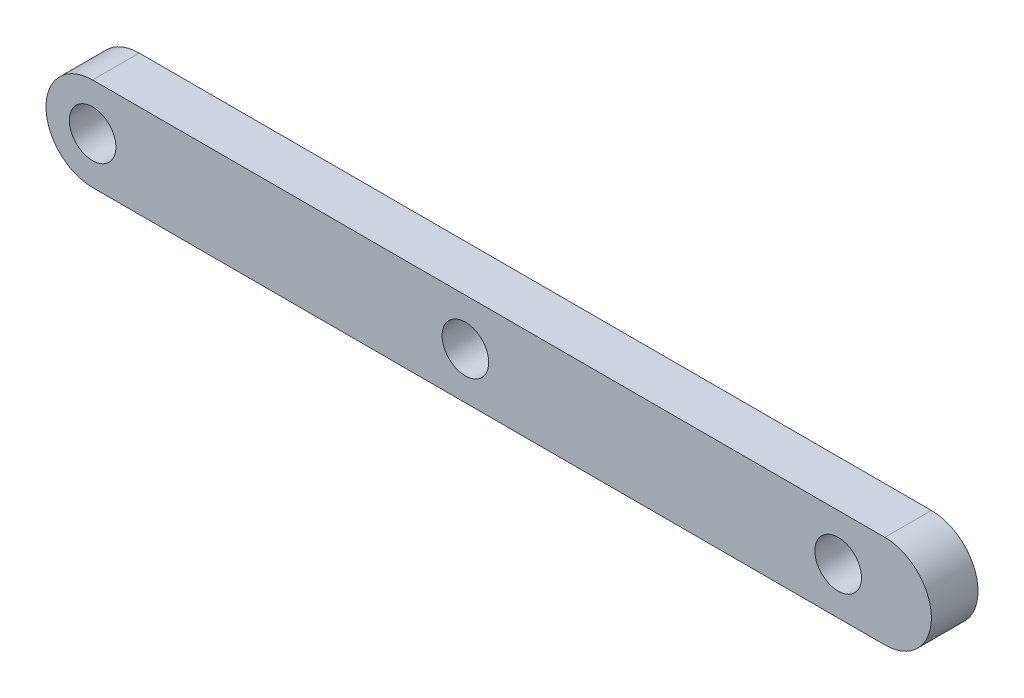
ISO-10303-21;
HEADER;
FILE_DESCRIPTION(('STEP AP214'),'2;1');
FILE_NAME('part.step','',(''),(''),'','','');
FILE_SCHEMA(('AUTOMOTIVE_DESIGN { 1 0 10303 214 1 1 1 1 }'));
ENDSEC;
DATA;
#1=APPLICATION_CONTEXT('core data for automotive mechanical design processes');
#2=APPLICATION_PROTOCOL_DEFINITION('international standard','automotive_design',2000,#1);
#3=PRODUCT_CONTEXT('',#1,'mechanical');
#4=PRODUCT('Part','Part','',(#3));
#5=PRODUCT_RELATED_PRODUCT_CATEGORY('part','',(#4));
#6=PRODUCT_DEFINITION_FORMATION('','',#4);
#7=PRODUCT_DEFINITION_CONTEXT('part definition',#1,'design');
#8=PRODUCT_DEFINITION('design','',#6,#7);
#9=PRODUCT_DEFINITION_SHAPE('','',#8);
#10=(LENGTH_UNIT() NAMED_UNIT(*) SI_UNIT(.MILLI.,.METRE.));
#11=(NAMED_UNIT(*) PLANE_ANGLE_UNIT() SI_UNIT($,.RADIAN.));
#12=(NAMED_UNIT(*) SI_UNIT($,.STERADIAN.) SOLID_ANGLE_UNIT());
#13=UNCERTAINTY_MEASURE_WITH_UNIT(LENGTH_MEASURE(1.E-05),#10,'distance_accuracy_value','');
#14=(GEOMETRIC_REPRESENTATION_CONTEXT(3) GLOBAL_UNCERTAINTY_ASSIGNED_CONTEXT((#13)) GLOBAL_UNIT_ASSIGNED_CONTEXT((#10,
#11,#12)) REPRESENTATION_CONTEXT('',''));
#15=CARTESIAN_POINT('',(0.,0.,0.));
#16=DIRECTION('',(0.,0.,1.));
#17=DIRECTION('',(1.,0.,0.));
#18=AXIS2_PLACEMENT_3D('',#15,#16,#17);
#19=CARTESIAN_POINT('',(0.,0.,2.));
#20=DIRECTION('',(0.,0.,-1.));
#21=DIRECTION('',(-1.,0.,0.));
#22=AXIS2_PLACEMENT_3D('',#19,#20,#21);
#23=CYLINDRICAL_SURFACE('',#22,2.);
#24=CARTESIAN_POINT('',(0.,0.,0.));
#25=DIRECTION('',(0.,0.,1.));
#26=DIRECTION('',(1.,0.,0.));
#27=AXIS2_PLACEMENT_3D('',#24,#25,#26);
#28=CIRCLE('',#27,2.);
#29=CARTESIAN_POINT('',(0.,2.,0.));
#30=VERTEX_POINT('',#29);
#31=CARTESIAN_POINT('',(0.,-2.,0.));
#32=VERTEX_POINT('',#31);
#33=EDGE_CURVE('E113',#30,#32,#28,.T.);
#34=ORIENTED_EDGE('',*,*,#33,.T.);
#35=DIRECTION('',(0.,0.,-1.));
#36=VECTOR('',#35,1.);
#37=CARTESIAN_POINT('',(0.,-2.,2.));
#38=LINE('',#37,#36);
#39=CARTESIAN_POINT('',(0.,-2.,2.));
#40=VERTEX_POINT('',#39);
#41=EDGE_CURVE('E11',#40,#32,#38,.T.);
#42=ORIENTED_EDGE('',*,*,#41,.F.);
#43=CARTESIAN_POINT('',(0.,0.,2.));
#44=DIRECTION('',(0.,0.,1.));
#45=DIRECTION('',(1.,0.,0.));
#46=AXIS2_PLACEMENT_3D('',#43,#44,#45);
#47=CIRCLE('',#46,2.);
#48=CARTESIAN_POINT('',(0.,2.,2.));
#49=VERTEX_POINT('',#48);
#50=EDGE_CURVE('E97',#49,#40,#47,.T.);
#51=ORIENTED_EDGE('',*,*,#50,.F.);
#52=DIRECTION('',(0.,0.,-1.));
#53=VECTOR('',#52,1.);
#54=CARTESIAN_POINT('',(0.,2.,2.));
#55=LINE('',#54,#53);
#56=EDGE_CURVE('E109',#49,#30,#55,.T.);
#57=ORIENTED_EDGE('',*,*,#56,.T.);
#58=EDGE_LOOP('',(#34,#42,#51,#57));
#59=FACE_BOUND('',#58,.T.);
#60=ADVANCED_FACE('F45',(#59),#23,.T.);
#61=CARTESIAN_POINT('',(0.,-2.,2.));
#62=DIRECTION('',(0.,1.,0.));
#63=DIRECTION('',(0.,0.,1.));
#64=AXIS2_PLACEMENT_3D('',#61,#62,#63);
#65=PLANE('',#64);
#66=DIRECTION('',(1.,0.,0.));
#67=VECTOR('',#66,1.);
#68=CARTESIAN_POINT('',(0.,-2.,0.));
#69=LINE('',#68,#67);
#70=CARTESIAN_POINT('',(34.,-2.,0.));
#71=VERTEX_POINT('',#70);
#72=EDGE_CURVE('E102',#32,#71,#69,.T.);
#73=ORIENTED_EDGE('',*,*,#72,.T.);
#74=DIRECTION('',(0.,0.,-1.));
#75=VECTOR('',#74,1.);
#76=CARTESIAN_POINT('',(34.,-2.,2.));
#77=LINE('',#76,#75);
#78=CARTESIAN_POINT('',(34.,-2.,2.));
#79=VERTEX_POINT('',#78);
#80=EDGE_CURVE('E54',#79,#71,#77,.T.);
#81=ORIENTED_EDGE('',*,*,#80,.F.);
#82=DIRECTION('',(1.,0.,0.));
#83=VECTOR('',#82,1.);
#84=CARTESIAN_POINT('',(0.,-2.,2.));
#85=LINE('',#84,#83);
#86=EDGE_CURVE('E92',#40,#79,#85,.T.);
#87=ORIENTED_EDGE('',*,*,#86,.F.);
#88=ORIENTED_EDGE('',*,*,#41,.T.);
#89=EDGE_LOOP('',(#73,#81,#87,#88));
#90=FACE_BOUND('',#89,.T.);
#91=ADVANCED_FACE('F101',(#90),#65,.F.);
#92=CARTESIAN_POINT('',(34.,0.,2.));
#93=DIRECTION('',(0.,0.,-1.));
#94=DIRECTION('',(-1.,0.,0.));
#95=AXIS2_PLACEMENT_3D('',#92,#93,#94);
#96=CYLINDRICAL_SURFACE('',#95,2.);
#97=CARTESIAN_POINT('',(34.,0.,0.));
#98=DIRECTION('',(0.,0.,1.));
#99=DIRECTION('',(1.,0.,0.));
#100=AXIS2_PLACEMENT_3D('',#97,#98,#99);
#101=CIRCLE('',#100,2.);
#102=CARTESIAN_POINT('',(34.,2.,0.));
#103=VERTEX_POINT('',#102);
#104=EDGE_CURVE('E79',#71,#103,#101,.T.);
#105=ORIENTED_EDGE('',*,*,#104,.T.);
#106=DIRECTION('',(0.,0.,-1.));
#107=VECTOR('',#106,1.);
#108=CARTESIAN_POINT('',(34.,2.,2.));
#109=LINE('',#108,#107);
#110=CARTESIAN_POINT('',(34.,2.,2.));
#111=VERTEX_POINT('',#110);
#112=EDGE_CURVE('E104',#111,#103,#109,.T.);
#113=ORIENTED_EDGE('',*,*,#112,.F.);
#114=CARTESIAN_POINT('',(34.,0.,2.));
#115=DIRECTION('',(0.,0.,1.));
#116=DIRECTION('',(1.,0.,0.));
#117=AXIS2_PLACEMENT_3D('',#114,#115,#116);
#118=CIRCLE('',#117,2.);
#119=EDGE_CURVE('E95',#79,#111,#118,.T.);
#120=ORIENTED_EDGE('',*,*,#119,.F.);
#121=ORIENTED_EDGE('',*,*,#80,.T.);
#122=EDGE_LOOP('',(#105,#113,#120,#121));
#123=FACE_BOUND('',#122,.T.);
#124=ADVANCED_FACE('F105',(#123),#96,.T.);
#125=CARTESIAN_POINT('',(0.,2.,2.));
#126=DIRECTION('',(0.,-1.,0.));
#127=DIRECTION('',(0.,0.,-1.));
#128=AXIS2_PLACEMENT_3D('',#125,#126,#127);
#129=PLANE('',#128);
#130=DIRECTION('',(-1.,0.,0.));
#131=VECTOR('',#130,1.);
#132=CARTESIAN_POINT('',(0.,2.,0.));
#133=LINE('',#132,#131);
#134=EDGE_CURVE('E85',#103,#30,#133,.T.);
#135=ORIENTED_EDGE('',*,*,#134,.T.);
#136=ORIENTED_EDGE('',*,*,#56,.F.);
#137=DIRECTION('',(-1.,0.,0.));
#138=VECTOR('',#137,1.);
#139=CARTESIAN_POINT('',(0.,2.,2.));
#140=LINE('',#139,#138);
#141=EDGE_CURVE('E62',#111,#49,#140,.T.);
#142=ORIENTED_EDGE('',*,*,#141,.F.);
#143=ORIENTED_EDGE('',*,*,#112,.T.);
#144=EDGE_LOOP('',(#135,#136,#142,#143));
#145=FACE_BOUND('',#144,.T.);
#146=ADVANCED_FACE('F127',(#145),#129,.F.);
#147=CARTESIAN_POINT('',(0.,0.,2.));
#148=DIRECTION('',(0.,0.,1.));
#149=DIRECTION('',(1.,0.,0.));
#150=AXIS2_PLACEMENT_3D('',#147,#148,#149);
#151=PLANE('',#150);
#152=CARTESIAN_POINT('',(0.,0.,2.));
#153=DIRECTION('',(0.,0.,1.));
#154=DIRECTION('',(1.,0.,0.));
#155=AXIS2_PLACEMENT_3D('',#152,#153,#154);
#156=CIRCLE('',#155,1.);
#157=CARTESIAN_POINT('',(1.,0.,2.));
#158=VERTEX_POINT('',#157);
#159=EDGE_CURVE('E150',#158,#158,#156,.T.);
#160=ORIENTED_EDGE('',*,*,#159,.F.);
#161=EDGE_LOOP('',(#160));
#162=FACE_BOUND('',#161,.T.);
#163=CARTESIAN_POINT('',(16.,0.,2.));
#164=DIRECTION('',(0.,0.,1.));
#165=DIRECTION('',(1.,0.,0.));
#166=AXIS2_PLACEMENT_3D('',#163,#164,#165);
#167=CIRCLE('',#166,1.);
#168=CARTESIAN_POINT('',(17.,0.,2.));
#169=VERTEX_POINT('',#168);
#170=EDGE_CURVE('E146',#169,#169,#167,.T.);
#171=ORIENTED_EDGE('',*,*,#170,.F.);
#172=EDGE_LOOP('',(#171));
#173=FACE_BOUND('',#172,.T.);
#174=CARTESIAN_POINT('',(32.,0.,2.));
#175=DIRECTION('',(0.,0.,1.));
#176=DIRECTION('',(1.,0.,0.));
#177=AXIS2_PLACEMENT_3D('',#174,#175,#176);
#178=CIRCLE('',#177,0.999999999999998);
#179=CARTESIAN_POINT('',(33.,0.,2.));
#180=VERTEX_POINT('',#179);
#181=EDGE_CURVE('E138',#180,#180,#178,.T.);
#182=ORIENTED_EDGE('',*,*,#181,.F.);
#183=EDGE_LOOP('',(#182));
#184=FACE_BOUND('',#183,.T.);
#185=ORIENTED_EDGE('',*,*,#50,.T.);
#186=ORIENTED_EDGE('',*,*,#86,.T.);
#187=ORIENTED_EDGE('',*,*,#119,.T.);
#188=ORIENTED_EDGE('',*,*,#141,.T.);
#189=EDGE_LOOP('',(#185,#186,#187,#188));
#190=FACE_BOUND('',#189,.T.);
#191=ADVANCED_FACE('F93',(#162,#173,#184,#190),#151,.T.);
#192=CARTESIAN_POINT('',(0.,0.,0.));
#193=DIRECTION('',(0.,0.,1.));
#194=DIRECTION('',(1.,0.,0.));
#195=AXIS2_PLACEMENT_3D('',#192,#193,#194);
#196=PLANE('',#195);
#197=CARTESIAN_POINT('',(0.,0.,0.));
#198=DIRECTION('',(0.,0.,1.));
#199=DIRECTION('',(1.,0.,0.));
#200=AXIS2_PLACEMENT_3D('',#197,#198,#199);
#201=CIRCLE('',#200,1.);
#202=CARTESIAN_POINT('',(1.,0.,0.));
#203=VERTEX_POINT('',#202);
#204=EDGE_CURVE('E117',#203,#203,#201,.T.);
#205=ORIENTED_EDGE('',*,*,#204,.T.);
#206=EDGE_LOOP('',(#205));
#207=FACE_BOUND('',#206,.T.);
#208=CARTESIAN_POINT('',(16.,0.,0.));
#209=DIRECTION('',(0.,0.,1.));
#210=DIRECTION('',(1.,0.,0.));
#211=AXIS2_PLACEMENT_3D('',#208,#209,#210);
#212=CIRCLE('',#211,1.);
#213=CARTESIAN_POINT('',(17.,0.,0.));
#214=VERTEX_POINT('',#213);
#215=EDGE_CURVE('E142',#214,#214,#212,.T.);
#216=ORIENTED_EDGE('',*,*,#215,.T.);
#217=EDGE_LOOP('',(#216));
#218=FACE_BOUND('',#217,.T.);
#219=CARTESIAN_POINT('',(32.,0.,0.));
#220=DIRECTION('',(0.,0.,1.));
#221=DIRECTION('',(1.,0.,0.));
#222=AXIS2_PLACEMENT_3D('',#219,#220,#221);
#223=CIRCLE('',#222,0.999999999999998);
#224=CARTESIAN_POINT('',(33.,0.,0.));
#225=VERTEX_POINT('',#224);
#226=EDGE_CURVE('E134',#225,#225,#223,.T.);
#227=ORIENTED_EDGE('',*,*,#226,.T.);
#228=EDGE_LOOP('',(#227));
#229=FACE_BOUND('',#228,.T.);
#230=ORIENTED_EDGE('',*,*,#33,.F.);
#231=ORIENTED_EDGE('',*,*,#134,.F.);
#232=ORIENTED_EDGE('',*,*,#104,.F.);
#233=ORIENTED_EDGE('',*,*,#72,.F.);
#234=EDGE_LOOP('',(#230,#231,#232,#233));
#235=FACE_BOUND('',#234,.T.);
#236=ADVANCED_FACE('F130',(#207,#218,#229,#235),#196,.F.);
#237=CARTESIAN_POINT('',(32.,0.,0.));
#238=DIRECTION('',(0.,0.,1.));
#239=DIRECTION('',(1.,0.,0.));
#240=AXIS2_PLACEMENT_3D('',#237,#238,#239);
#241=CYLINDRICAL_SURFACE('',#240,0.999999999999998);
#242=ORIENTED_EDGE('',*,*,#226,.F.);
#243=EDGE_LOOP('',(#242));
#244=FACE_BOUND('',#243,.T.);
#245=ORIENTED_EDGE('',*,*,#181,.T.);
#246=EDGE_LOOP('',(#245));
#247=FACE_BOUND('',#246,.T.);
#248=ADVANCED_FACE('F174',(#244,#247),#241,.F.);
#249=CARTESIAN_POINT('',(16.,0.,0.));
#250=DIRECTION('',(0.,0.,1.));
#251=DIRECTION('',(1.,0.,0.));
#252=AXIS2_PLACEMENT_3D('',#249,#250,#251);
#253=CYLINDRICAL_SURFACE('',#252,1.);
#254=ORIENTED_EDGE('',*,*,#215,.F.);
#255=EDGE_LOOP('',(#254));
#256=FACE_BOUND('',#255,.T.);
#257=ORIENTED_EDGE('',*,*,#170,.T.);
#258=EDGE_LOOP('',(#257));
#259=FACE_BOUND('',#258,.T.);
#260=ADVANCED_FACE('F163',(#256,#259),#253,.F.);
#261=CARTESIAN_POINT('',(0.,0.,0.));
#262=DIRECTION('',(0.,0.,1.));
#263=DIRECTION('',(1.,0.,0.));
#264=AXIS2_PLACEMENT_3D('',#261,#262,#263);
#265=CYLINDRICAL_SURFACE('',#264,1.);
#266=ORIENTED_EDGE('',*,*,#204,.F.);
#267=EDGE_LOOP('',(#266));
#268=FACE_BOUND('',#267,.T.);
#269=ORIENTED_EDGE('',*,*,#159,.T.);
#270=EDGE_LOOP('',(#269));
#271=FACE_BOUND('',#270,.T.);
#272=ADVANCED_FACE('F160',(#268,#271),#265,.F.);
#273=CLOSED_SHELL('',(#60,#91,#124,#146,#191,#236,#248,#260,#272));
#274=MANIFOLD_SOLID_BREP('B2',#273);
#275=ADVANCED_BREP_SHAPE_REPRESENTATION('',(#18,#274),#14);
#276=SHAPE_DEFINITION_REPRESENTATION(#9,#275);
ENDSEC;
END-ISO-10303-21;
